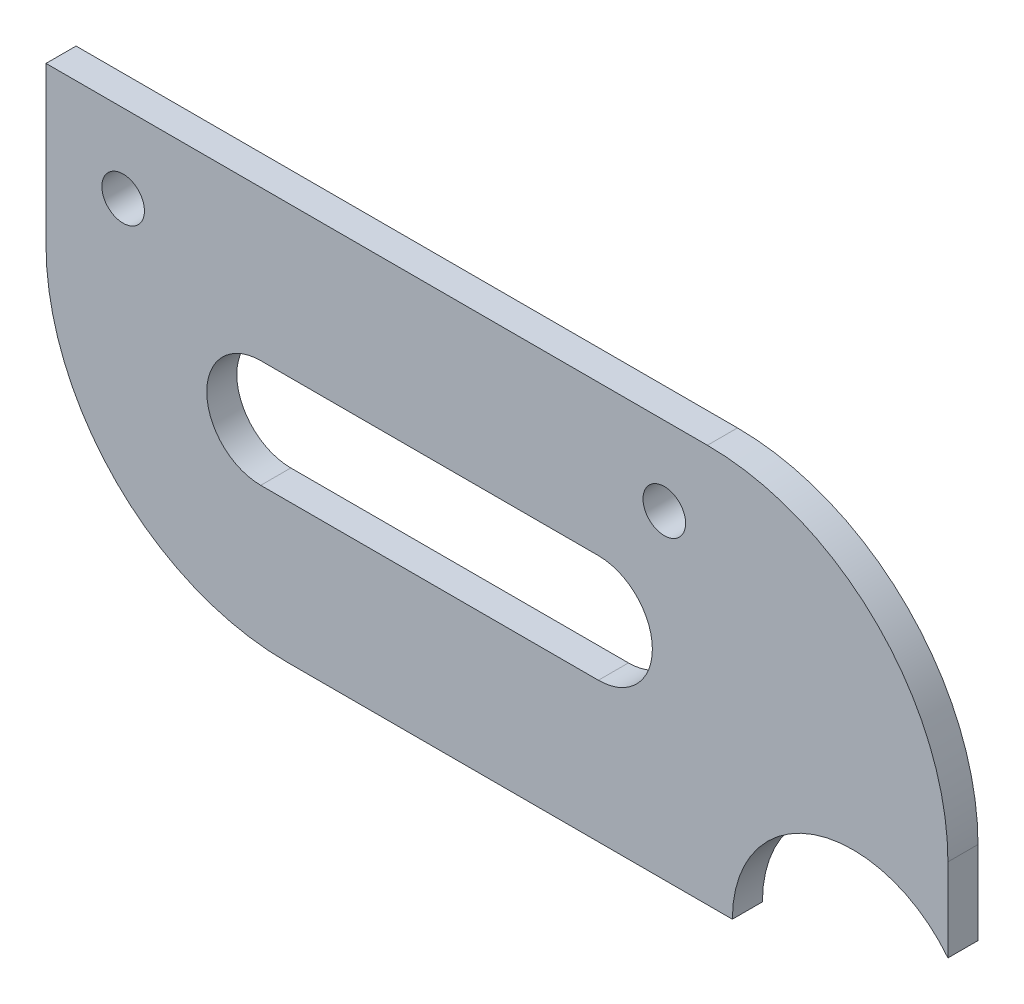
ISO-10303-21;
HEADER;
FILE_DESCRIPTION(('STEP AP214'),'2;1');
FILE_NAME('part.step','',(''),(''),'','','');
FILE_SCHEMA(('AUTOMOTIVE_DESIGN { 1 0 10303 214 1 1 1 1 }'));
ENDSEC;
DATA;
#1=APPLICATION_CONTEXT('core data for automotive mechanical design processes');
#2=APPLICATION_PROTOCOL_DEFINITION('international standard','automotive_design',2000,#1);
#3=PRODUCT_CONTEXT('',#1,'mechanical');
#4=PRODUCT('Part','Part','',(#3));
#5=PRODUCT_RELATED_PRODUCT_CATEGORY('part','',(#4));
#6=PRODUCT_DEFINITION_FORMATION('','',#4);
#7=PRODUCT_DEFINITION_CONTEXT('part definition',#1,'design');
#8=PRODUCT_DEFINITION('design','',#6,#7);
#9=PRODUCT_DEFINITION_SHAPE('','',#8);
#10=(LENGTH_UNIT() NAMED_UNIT(*) SI_UNIT(.MILLI.,.METRE.));
#11=(NAMED_UNIT(*) PLANE_ANGLE_UNIT() SI_UNIT($,.RADIAN.));
#12=(NAMED_UNIT(*) SI_UNIT($,.STERADIAN.) SOLID_ANGLE_UNIT());
#13=UNCERTAINTY_MEASURE_WITH_UNIT(LENGTH_MEASURE(1.E-05),#10,'distance_accuracy_value','');
#14=(GEOMETRIC_REPRESENTATION_CONTEXT(3) GLOBAL_UNCERTAINTY_ASSIGNED_CONTEXT((#13)) GLOBAL_UNIT_ASSIGNED_CONTEXT((#10,
#11,#12)) REPRESENTATION_CONTEXT('',''));
#15=CARTESIAN_POINT('',(0.,0.,0.));
#16=DIRECTION('',(0.,0.,1.));
#17=DIRECTION('',(1.,0.,0.));
#18=AXIS2_PLACEMENT_3D('',#15,#16,#17);
#19=CARTESIAN_POINT('',(70.719661658984,-46.4381788724495,3.175));
#20=DIRECTION('',(0.,0.,1.));
#21=DIRECTION('',(1.,0.,0.));
#22=AXIS2_PLACEMENT_3D('',#19,#20,#21);
#23=PLANE('',#22);
#24=CARTESIAN_POINT('',(50.7999999999998,-12.6990000330051,3.175));
#25=DIRECTION('',(0.,0.,-1.));
#26=DIRECTION('',(-1.,0.,0.));
#27=AXIS2_PLACEMENT_3D('',#24,#25,#26);
#28=CIRCLE('',#27,2.25);
#29=CARTESIAN_POINT('',(48.5499999999998,-12.6990000330051,3.175));
#30=VERTEX_POINT('',#29);
#31=EDGE_CURVE('E150',#30,#30,#28,.T.);
#32=ORIENTED_EDGE('',*,*,#31,.T.);
#33=EDGE_LOOP('',(#32));
#34=FACE_BOUND('',#33,.T.);
#35=CARTESIAN_POINT('',(-6.35,-12.699000033,3.175));
#36=DIRECTION('',(0.,0.,-1.));
#37=DIRECTION('',(-1.,0.,0.));
#38=AXIS2_PLACEMENT_3D('',#35,#36,#37);
#39=CIRCLE('',#38,2.25);
#40=CARTESIAN_POINT('',(-8.6,-12.699000033,3.175));
#41=VERTEX_POINT('',#40);
#42=EDGE_CURVE('E350',#41,#41,#39,.T.);
#43=ORIENTED_EDGE('',*,*,#42,.T.);
#44=EDGE_LOOP('',(#43));
#45=FACE_BOUND('',#44,.T.);
#46=DIRECTION('',(0.,1.,0.));
#47=VECTOR('',#46,1.);
#48=CARTESIAN_POINT('',(80.7528152775164,-4.40562225348035,3.175));
#49=LINE('',#48,#47);
#50=CARTESIAN_POINT('',(80.7528152775164,-38.5964374653407,3.175));
#51=VERTEX_POINT('',#50);
#52=CARTESIAN_POINT('',(80.7528152775164,-29.8056222534803,3.175));
#53=VERTEX_POINT('',#52);
#54=EDGE_CURVE('E168',#51,#53,#49,.T.);
#55=ORIENTED_EDGE('',*,*,#54,.T.);
#56=CARTESIAN_POINT('',(55.3528152775164,-29.8056222534803,3.175));
#57=DIRECTION('',(0.,0.,1.));
#58=DIRECTION('',(1.,0.,0.));
#59=AXIS2_PLACEMENT_3D('',#56,#57,#58);
#60=CIRCLE('',#59,25.4);
#61=CARTESIAN_POINT('',(55.3528152775164,-4.40562225348035,3.175));
#62=VERTEX_POINT('',#61);
#63=EDGE_CURVE('E201',#53,#62,#60,.T.);
#64=ORIENTED_EDGE('',*,*,#63,.T.);
#65=DIRECTION('',(-1.,0.,0.));
#66=VECTOR('',#65,1.);
#67=CARTESIAN_POINT('',(-14.4971847224836,-4.40562225348035,3.175));
#68=LINE('',#67,#66);
#69=CARTESIAN_POINT('',(-14.4971847224836,-4.40562225348035,3.175));
#70=VERTEX_POINT('',#69);
#71=EDGE_CURVE('E171',#62,#70,#68,.T.);
#72=ORIENTED_EDGE('',*,*,#71,.T.);
#73=DIRECTION('',(0.,-1.,0.));
#74=VECTOR('',#73,1.);
#75=CARTESIAN_POINT('',(-14.4971847224836,-4.40562225348035,3.175));
#76=LINE('',#75,#74);
#77=CARTESIAN_POINT('',(-14.4971847224836,-21.0381788724495,3.175));
#78=VERTEX_POINT('',#77);
#79=EDGE_CURVE('E161',#70,#78,#76,.T.);
#80=ORIENTED_EDGE('',*,*,#79,.T.);
#81=CARTESIAN_POINT('',(10.9028152775164,-21.0381788724495,3.175));
#82=DIRECTION('',(0.,0.,1.));
#83=DIRECTION('',(1.,0.,0.));
#84=AXIS2_PLACEMENT_3D('',#81,#82,#83);
#85=CIRCLE('',#84,25.4);
#86=CARTESIAN_POINT('',(10.9028152775164,-46.4381788724495,3.175));
#87=VERTEX_POINT('',#86);
#88=EDGE_CURVE('E49',#78,#87,#85,.T.);
#89=ORIENTED_EDGE('',*,*,#88,.T.);
#90=DIRECTION('',(1.,0.,0.));
#91=VECTOR('',#90,1.);
#92=CARTESIAN_POINT('',(57.985570414257,-46.4381788724495,3.175));
#93=LINE('',#92,#91);
#94=CARTESIAN_POINT('',(57.985570414257,-46.4381788724495,3.175));
#95=VERTEX_POINT('',#94);
#96=EDGE_CURVE('E163',#87,#95,#93,.T.);
#97=ORIENTED_EDGE('',*,*,#96,.T.);
#98=CARTESIAN_POINT('',(70.719661658984,-46.4381788724495,3.175));
#99=DIRECTION('',(0.,0.,-1.));
#100=DIRECTION('',(1.,0.,0.));
#101=AXIS2_PLACEMENT_3D('',#98,#99,#100);
#102=CIRCLE('',#101,12.7340912447271);
#103=EDGE_CURVE('E166',#95,#51,#102,.T.);
#104=ORIENTED_EDGE('',*,*,#103,.T.);
#105=EDGE_LOOP('',(#55,#64,#72,#80,#89,#97,#104));
#106=FACE_BOUND('',#105,.T.);
#107=DIRECTION('',(1.,0.,0.));
#108=VECTOR('',#107,1.);
#109=CARTESIAN_POINT('',(8.18012904212218,-31.654487563312,3.175));
#110=LINE('',#109,#108);
#111=CARTESIAN_POINT('',(8.18012904212218,-31.654487563312,3.175));
#112=VERTEX_POINT('',#111);
#113=CARTESIAN_POINT('',(43.8381196955397,-31.654487563312,3.175));
#114=VERTEX_POINT('',#113);
#115=EDGE_CURVE('E128',#112,#114,#110,.T.);
#116=ORIENTED_EDGE('',*,*,#115,.F.);
#117=CARTESIAN_POINT('',(8.18012904212218,-25.954568173356,3.175));
#118=DIRECTION('',(0.,0.,1.));
#119=DIRECTION('',(1.,0.,0.));
#120=AXIS2_PLACEMENT_3D('',#117,#118,#119);
#121=CIRCLE('',#120,5.69991938995607);
#122=CARTESIAN_POINT('',(8.18012904212218,-20.2546487833999,3.175));
#123=VERTEX_POINT('',#122);
#124=EDGE_CURVE('E118',#123,#112,#121,.T.);
#125=ORIENTED_EDGE('',*,*,#124,.F.);
#126=DIRECTION('',(-1.,0.,0.));
#127=VECTOR('',#126,1.);
#128=CARTESIAN_POINT('',(8.18012904212218,-20.2546487833999,3.175));
#129=LINE('',#128,#127);
#130=CARTESIAN_POINT('',(43.8381196955397,-20.2546487833999,3.175));
#131=VERTEX_POINT('',#130);
#132=EDGE_CURVE('E143',#131,#123,#129,.T.);
#133=ORIENTED_EDGE('',*,*,#132,.F.);
#134=CARTESIAN_POINT('',(43.8381196955397,-25.954568173356,3.175));
#135=DIRECTION('',(0.,0.,1.));
#136=DIRECTION('',(1.,0.,0.));
#137=AXIS2_PLACEMENT_3D('',#134,#135,#136);
#138=CIRCLE('',#137,5.69991938995607);
#139=EDGE_CURVE('E141',#114,#131,#138,.T.);
#140=ORIENTED_EDGE('',*,*,#139,.F.);
#141=EDGE_LOOP('',(#116,#125,#133,#140));
#142=FACE_BOUND('',#141,.T.);
#143=ADVANCED_FACE('F34',(#34,#45,#106,#142),#23,.T.);
#144=CARTESIAN_POINT('',(70.719661658984,-46.4381788724495,0.));
#145=DIRECTION('',(0.,0.,1.));
#146=DIRECTION('',(1.,0.,0.));
#147=AXIS2_PLACEMENT_3D('',#144,#145,#146);
#148=PLANE('',#147);
#149=CARTESIAN_POINT('',(50.7999999999998,-12.6990000330051,0.));
#150=DIRECTION('',(0.,0.,-1.));
#151=DIRECTION('',(-1.,0.,0.));
#152=AXIS2_PLACEMENT_3D('',#149,#150,#151);
#153=CIRCLE('',#152,2.25);
#154=CARTESIAN_POINT('',(48.5499999999998,-12.6990000330051,0.));
#155=VERTEX_POINT('',#154);
#156=EDGE_CURVE('E349',#155,#155,#153,.T.);
#157=ORIENTED_EDGE('',*,*,#156,.F.);
#158=EDGE_LOOP('',(#157));
#159=FACE_BOUND('',#158,.T.);
#160=CARTESIAN_POINT('',(-6.35,-12.699000033,0.));
#161=DIRECTION('',(0.,0.,-1.));
#162=DIRECTION('',(-1.,0.,0.));
#163=AXIS2_PLACEMENT_3D('',#160,#161,#162);
#164=CIRCLE('',#163,2.25);
#165=CARTESIAN_POINT('',(-8.6,-12.699000033,0.));
#166=VERTEX_POINT('',#165);
#167=EDGE_CURVE('E354',#166,#166,#164,.T.);
#168=ORIENTED_EDGE('',*,*,#167,.F.);
#169=EDGE_LOOP('',(#168));
#170=FACE_BOUND('',#169,.T.);
#171=DIRECTION('',(-1.,0.,0.));
#172=VECTOR('',#171,1.);
#173=CARTESIAN_POINT('',(-14.4971847224836,-4.40562225348035,0.));
#174=LINE('',#173,#172);
#175=CARTESIAN_POINT('',(55.3528152775164,-4.40562225348035,0.));
#176=VERTEX_POINT('',#175);
#177=CARTESIAN_POINT('',(-14.4971847224836,-4.40562225348035,0.));
#178=VERTEX_POINT('',#177);
#179=EDGE_CURVE('E164',#176,#178,#174,.T.);
#180=ORIENTED_EDGE('',*,*,#179,.F.);
#181=CARTESIAN_POINT('',(55.3528152775164,-29.8056222534803,0.));
#182=DIRECTION('',(0.,0.,1.));
#183=DIRECTION('',(1.,0.,0.));
#184=AXIS2_PLACEMENT_3D('',#181,#182,#183);
#185=CIRCLE('',#184,25.4);
#186=CARTESIAN_POINT('',(80.7528152775164,-29.8056222534803,0.));
#187=VERTEX_POINT('',#186);
#188=EDGE_CURVE('E196',#176,#187,#185,.F.);
#189=ORIENTED_EDGE('',*,*,#188,.T.);
#190=DIRECTION('',(0.,1.,0.));
#191=VECTOR('',#190,1.);
#192=CARTESIAN_POINT('',(80.7528152775164,-4.40562225348035,0.));
#193=LINE('',#192,#191);
#194=CARTESIAN_POINT('',(80.7528152775164,-38.5964374653407,0.));
#195=VERTEX_POINT('',#194);
#196=EDGE_CURVE('E179',#195,#187,#193,.T.);
#197=ORIENTED_EDGE('',*,*,#196,.F.);
#198=CARTESIAN_POINT('',(70.719661658984,-46.4381788724495,0.));
#199=DIRECTION('',(0.,0.,-1.));
#200=DIRECTION('',(1.,0.,0.));
#201=AXIS2_PLACEMENT_3D('',#198,#199,#200);
#202=CIRCLE('',#201,12.7340912447271);
#203=CARTESIAN_POINT('',(57.985570414257,-46.4381788724495,0.));
#204=VERTEX_POINT('',#203);
#205=EDGE_CURVE('E177',#204,#195,#202,.T.);
#206=ORIENTED_EDGE('',*,*,#205,.F.);
#207=DIRECTION('',(1.,0.,0.));
#208=VECTOR('',#207,1.);
#209=CARTESIAN_POINT('',(57.985570414257,-46.4381788724495,0.));
#210=LINE('',#209,#208);
#211=CARTESIAN_POINT('',(10.9028152775164,-46.4381788724495,0.));
#212=VERTEX_POINT('',#211);
#213=EDGE_CURVE('E175',#212,#204,#210,.T.);
#214=ORIENTED_EDGE('',*,*,#213,.F.);
#215=CARTESIAN_POINT('',(10.9028152775164,-21.0381788724495,0.));
#216=DIRECTION('',(0.,0.,1.));
#217=DIRECTION('',(1.,0.,0.));
#218=AXIS2_PLACEMENT_3D('',#215,#216,#217);
#219=CIRCLE('',#218,25.4);
#220=CARTESIAN_POINT('',(-14.4971847224836,-21.0381788724495,0.));
#221=VERTEX_POINT('',#220);
#222=EDGE_CURVE('E194',#212,#221,#219,.F.);
#223=ORIENTED_EDGE('',*,*,#222,.T.);
#224=DIRECTION('',(0.,-1.,0.));
#225=VECTOR('',#224,1.);
#226=CARTESIAN_POINT('',(-14.4971847224836,-4.40562225348035,0.));
#227=LINE('',#226,#225);
#228=EDGE_CURVE('E136',#178,#221,#227,.T.);
#229=ORIENTED_EDGE('',*,*,#228,.F.);
#230=EDGE_LOOP('',(#180,#189,#197,#206,#214,#223,#229));
#231=FACE_BOUND('',#230,.T.);
#232=CARTESIAN_POINT('',(8.18012904212218,-25.954568173356,0.));
#233=DIRECTION('',(0.,0.,1.));
#234=DIRECTION('',(1.,0.,0.));
#235=AXIS2_PLACEMENT_3D('',#232,#233,#234);
#236=CIRCLE('',#235,5.69991938995607);
#237=CARTESIAN_POINT('',(8.18012904212218,-20.2546487833999,0.));
#238=VERTEX_POINT('',#237);
#239=CARTESIAN_POINT('',(8.18012904212218,-31.654487563312,0.));
#240=VERTEX_POINT('',#239);
#241=EDGE_CURVE('E148',#238,#240,#236,.T.);
#242=ORIENTED_EDGE('',*,*,#241,.T.);
#243=DIRECTION('',(1.,0.,0.));
#244=VECTOR('',#243,1.);
#245=CARTESIAN_POINT('',(8.18012904212218,-31.654487563312,0.));
#246=LINE('',#245,#244);
#247=CARTESIAN_POINT('',(43.8381196955397,-31.654487563312,0.));
#248=VERTEX_POINT('',#247);
#249=EDGE_CURVE('E135',#240,#248,#246,.T.);
#250=ORIENTED_EDGE('',*,*,#249,.T.);
#251=CARTESIAN_POINT('',(43.8381196955397,-25.954568173356,0.));
#252=DIRECTION('',(0.,0.,1.));
#253=DIRECTION('',(1.,0.,0.));
#254=AXIS2_PLACEMENT_3D('',#251,#252,#253);
#255=CIRCLE('',#254,5.69991938995607);
#256=CARTESIAN_POINT('',(43.8381196955397,-20.2546487833999,0.));
#257=VERTEX_POINT('',#256);
#258=EDGE_CURVE('E152',#248,#257,#255,.T.);
#259=ORIENTED_EDGE('',*,*,#258,.T.);
#260=DIRECTION('',(-1.,0.,0.));
#261=VECTOR('',#260,1.);
#262=CARTESIAN_POINT('',(8.18012904212218,-20.2546487833999,0.));
#263=LINE('',#262,#261);
#264=EDGE_CURVE('E129',#257,#238,#263,.T.);
#265=ORIENTED_EDGE('',*,*,#264,.T.);
#266=EDGE_LOOP('',(#242,#250,#259,#265));
#267=FACE_BOUND('',#266,.T.);
#268=ADVANCED_FACE('F212',(#159,#170,#231,#267),#148,.F.);
#269=CARTESIAN_POINT('',(-14.4971847224836,-4.40562225348035,3.175));
#270=DIRECTION('',(1.,0.,0.));
#271=DIRECTION('',(0.,0.,-1.));
#272=AXIS2_PLACEMENT_3D('',#269,#270,#271);
#273=PLANE('',#272);
#274=ORIENTED_EDGE('',*,*,#228,.T.);
#275=DIRECTION('',(0.,0.,-1.));
#276=VECTOR('',#275,1.);
#277=CARTESIAN_POINT('',(-14.4971847224836,-21.0381788724495,3.175));
#278=LINE('',#277,#276);
#279=EDGE_CURVE('E11',#221,#78,#278,.F.);
#280=ORIENTED_EDGE('',*,*,#279,.T.);
#281=ORIENTED_EDGE('',*,*,#79,.F.);
#282=DIRECTION('',(0.,0.,-1.));
#283=VECTOR('',#282,1.);
#284=CARTESIAN_POINT('',(-14.4971847224836,-4.40562225348035,3.175));
#285=LINE('',#284,#283);
#286=EDGE_CURVE('E173',#70,#178,#285,.T.);
#287=ORIENTED_EDGE('',*,*,#286,.T.);
#288=EDGE_LOOP('',(#274,#280,#281,#287));
#289=FACE_BOUND('',#288,.T.);
#290=ADVANCED_FACE('F232',(#289),#273,.F.);
#291=CARTESIAN_POINT('',(57.985570414257,-46.4381788724495,3.175));
#292=DIRECTION('',(0.,1.,0.));
#293=DIRECTION('',(0.,0.,1.));
#294=AXIS2_PLACEMENT_3D('',#291,#292,#293);
#295=PLANE('',#294);
#296=ORIENTED_EDGE('',*,*,#96,.F.);
#297=DIRECTION('',(0.,0.,-1.));
#298=VECTOR('',#297,1.);
#299=CARTESIAN_POINT('',(10.9028152775164,-46.4381788724495,3.175));
#300=LINE('',#299,#298);
#301=EDGE_CURVE('E42',#87,#212,#300,.T.);
#302=ORIENTED_EDGE('',*,*,#301,.T.);
#303=ORIENTED_EDGE('',*,*,#213,.T.);
#304=DIRECTION('',(0.,0.,-1.));
#305=VECTOR('',#304,1.);
#306=CARTESIAN_POINT('',(57.985570414257,-46.4381788724495,3.175));
#307=LINE('',#306,#305);
#308=EDGE_CURVE('E188',#95,#204,#307,.T.);
#309=ORIENTED_EDGE('',*,*,#308,.F.);
#310=EDGE_LOOP('',(#296,#302,#303,#309));
#311=FACE_BOUND('',#310,.T.);
#312=ADVANCED_FACE('F206',(#311),#295,.F.);
#313=CARTESIAN_POINT('',(70.719661658984,-46.4381788724495,3.175));
#314=DIRECTION('',(0.,0.,-1.));
#315=DIRECTION('',(-1.,0.,0.));
#316=AXIS2_PLACEMENT_3D('',#313,#314,#315);
#317=CYLINDRICAL_SURFACE('',#316,12.7340912447271);
#318=ORIENTED_EDGE('',*,*,#205,.T.);
#319=DIRECTION('',(0.,0.,-1.));
#320=VECTOR('',#319,1.);
#321=CARTESIAN_POINT('',(80.7528152775164,-38.5964374653407,3.175));
#322=LINE('',#321,#320);
#323=EDGE_CURVE('E185',#51,#195,#322,.T.);
#324=ORIENTED_EDGE('',*,*,#323,.F.);
#325=ORIENTED_EDGE('',*,*,#103,.F.);
#326=ORIENTED_EDGE('',*,*,#308,.T.);
#327=EDGE_LOOP('',(#318,#324,#325,#326));
#328=FACE_BOUND('',#327,.T.);
#329=ADVANCED_FACE('F218',(#328),#317,.F.);
#330=CARTESIAN_POINT('',(80.7528152775164,-4.40562225348035,3.175));
#331=DIRECTION('',(-1.,0.,0.));
#332=DIRECTION('',(0.,-1.,0.));
#333=AXIS2_PLACEMENT_3D('',#330,#331,#332);
#334=PLANE('',#333);
#335=ORIENTED_EDGE('',*,*,#196,.T.);
#336=DIRECTION('',(0.,0.,-1.));
#337=VECTOR('',#336,1.);
#338=CARTESIAN_POINT('',(80.7528152775164,-29.8056222534803,3.175));
#339=LINE('',#338,#337);
#340=EDGE_CURVE('E198',#187,#53,#339,.F.);
#341=ORIENTED_EDGE('',*,*,#340,.T.);
#342=ORIENTED_EDGE('',*,*,#54,.F.);
#343=ORIENTED_EDGE('',*,*,#323,.T.);
#344=EDGE_LOOP('',(#335,#341,#342,#343));
#345=FACE_BOUND('',#344,.T.);
#346=ADVANCED_FACE('F222',(#345),#334,.F.);
#347=CARTESIAN_POINT('',(-14.4971847224836,-4.40562225348035,3.175));
#348=DIRECTION('',(0.,-1.,0.));
#349=DIRECTION('',(0.,0.,-1.));
#350=AXIS2_PLACEMENT_3D('',#347,#348,#349);
#351=PLANE('',#350);
#352=ORIENTED_EDGE('',*,*,#71,.F.);
#353=DIRECTION('',(0.,0.,-1.));
#354=VECTOR('',#353,1.);
#355=CARTESIAN_POINT('',(55.3528152775164,-4.40562225348035,3.175));
#356=LINE('',#355,#354);
#357=EDGE_CURVE('E191',#62,#176,#356,.T.);
#358=ORIENTED_EDGE('',*,*,#357,.T.);
#359=ORIENTED_EDGE('',*,*,#179,.T.);
#360=ORIENTED_EDGE('',*,*,#286,.F.);
#361=EDGE_LOOP('',(#352,#358,#359,#360));
#362=FACE_BOUND('',#361,.T.);
#363=ADVANCED_FACE('F230',(#362),#351,.F.);
#364=CARTESIAN_POINT('',(8.18012904212218,-25.954568173356,3.175));
#365=DIRECTION('',(0.,0.,-1.));
#366=DIRECTION('',(-1.,0.,0.));
#367=AXIS2_PLACEMENT_3D('',#364,#365,#366);
#368=CYLINDRICAL_SURFACE('',#367,5.69991938995607);
#369=ORIENTED_EDGE('',*,*,#241,.F.);
#370=DIRECTION('',(0.,0.,-1.));
#371=VECTOR('',#370,1.);
#372=CARTESIAN_POINT('',(8.18012904212218,-20.2546487833999,3.175));
#373=LINE('',#372,#371);
#374=EDGE_CURVE('E124',#123,#238,#373,.T.);
#375=ORIENTED_EDGE('',*,*,#374,.F.);
#376=ORIENTED_EDGE('',*,*,#124,.T.);
#377=DIRECTION('',(0.,0.,-1.));
#378=VECTOR('',#377,1.);
#379=CARTESIAN_POINT('',(8.18012904212218,-31.654487563312,3.175));
#380=LINE('',#379,#378);
#381=EDGE_CURVE('E121',#112,#240,#380,.T.);
#382=ORIENTED_EDGE('',*,*,#381,.T.);
#383=EDGE_LOOP('',(#369,#375,#376,#382));
#384=FACE_BOUND('',#383,.T.);
#385=ADVANCED_FACE('F120',(#384),#368,.F.);
#386=CARTESIAN_POINT('',(8.18012904212218,-31.654487563312,3.175));
#387=DIRECTION('',(0.,1.,0.));
#388=DIRECTION('',(0.,0.,1.));
#389=AXIS2_PLACEMENT_3D('',#386,#387,#388);
#390=PLANE('',#389);
#391=ORIENTED_EDGE('',*,*,#249,.F.);
#392=ORIENTED_EDGE('',*,*,#381,.F.);
#393=ORIENTED_EDGE('',*,*,#115,.T.);
#394=DIRECTION('',(0.,0.,-1.));
#395=VECTOR('',#394,1.);
#396=CARTESIAN_POINT('',(43.8381196955397,-31.654487563312,3.175));
#397=LINE('',#396,#395);
#398=EDGE_CURVE('E137',#114,#248,#397,.T.);
#399=ORIENTED_EDGE('',*,*,#398,.T.);
#400=EDGE_LOOP('',(#391,#392,#393,#399));
#401=FACE_BOUND('',#400,.T.);
#402=ADVANCED_FACE('F132',(#401),#390,.T.);
#403=CARTESIAN_POINT('',(43.8381196955397,-25.954568173356,3.175));
#404=DIRECTION('',(0.,0.,-1.));
#405=DIRECTION('',(-1.,0.,0.));
#406=AXIS2_PLACEMENT_3D('',#403,#404,#405);
#407=CYLINDRICAL_SURFACE('',#406,5.69991938995607);
#408=ORIENTED_EDGE('',*,*,#258,.F.);
#409=ORIENTED_EDGE('',*,*,#398,.F.);
#410=ORIENTED_EDGE('',*,*,#139,.T.);
#411=DIRECTION('',(0.,0.,-1.));
#412=VECTOR('',#411,1.);
#413=CARTESIAN_POINT('',(43.8381196955397,-20.2546487833999,3.175));
#414=LINE('',#413,#412);
#415=EDGE_CURVE('E158',#131,#257,#414,.T.);
#416=ORIENTED_EDGE('',*,*,#415,.T.);
#417=EDGE_LOOP('',(#408,#409,#410,#416));
#418=FACE_BOUND('',#417,.T.);
#419=ADVANCED_FACE('F298',(#418),#407,.F.);
#420=CARTESIAN_POINT('',(8.18012904212218,-20.2546487833999,3.175));
#421=DIRECTION('',(0.,-1.,0.));
#422=DIRECTION('',(0.,0.,-1.));
#423=AXIS2_PLACEMENT_3D('',#420,#421,#422);
#424=PLANE('',#423);
#425=ORIENTED_EDGE('',*,*,#264,.F.);
#426=ORIENTED_EDGE('',*,*,#415,.F.);
#427=ORIENTED_EDGE('',*,*,#132,.T.);
#428=ORIENTED_EDGE('',*,*,#374,.T.);
#429=EDGE_LOOP('',(#425,#426,#427,#428));
#430=FACE_BOUND('',#429,.T.);
#431=ADVANCED_FACE('F242',(#430),#424,.T.);
#432=CARTESIAN_POINT('',(55.3528152775164,-29.8056222534803,3.175));
#433=DIRECTION('',(0.,0.,-1.));
#434=DIRECTION('',(-1.,0.,0.));
#435=AXIS2_PLACEMENT_3D('',#432,#433,#434);
#436=CYLINDRICAL_SURFACE('',#435,25.4);
#437=ORIENTED_EDGE('',*,*,#63,.F.);
#438=ORIENTED_EDGE('',*,*,#340,.F.);
#439=ORIENTED_EDGE('',*,*,#188,.F.);
#440=ORIENTED_EDGE('',*,*,#357,.F.);
#441=EDGE_LOOP('',(#437,#438,#439,#440));
#442=FACE_BOUND('',#441,.T.);
#443=ADVANCED_FACE('F228',(#442),#436,.T.);
#444=CARTESIAN_POINT('',(10.9028152775164,-21.0381788724495,3.175));
#445=DIRECTION('',(0.,0.,-1.));
#446=DIRECTION('',(-1.,0.,0.));
#447=AXIS2_PLACEMENT_3D('',#444,#445,#446);
#448=CYLINDRICAL_SURFACE('',#447,25.4);
#449=ORIENTED_EDGE('',*,*,#88,.F.);
#450=ORIENTED_EDGE('',*,*,#279,.F.);
#451=ORIENTED_EDGE('',*,*,#222,.F.);
#452=ORIENTED_EDGE('',*,*,#301,.F.);
#453=EDGE_LOOP('',(#449,#450,#451,#452));
#454=FACE_BOUND('',#453,.T.);
#455=ADVANCED_FACE('F36',(#454),#448,.T.);
#456=CARTESIAN_POINT('',(-6.35,-12.699000033,3.175));
#457=DIRECTION('',(0.,0.,-1.));
#458=DIRECTION('',(-1.,0.,0.));
#459=AXIS2_PLACEMENT_3D('',#456,#457,#458);
#460=CYLINDRICAL_SURFACE('',#459,2.25);
#461=ORIENTED_EDGE('',*,*,#42,.F.);
#462=EDGE_LOOP('',(#461));
#463=FACE_BOUND('',#462,.T.);
#464=ORIENTED_EDGE('',*,*,#167,.T.);
#465=EDGE_LOOP('',(#464));
#466=FACE_BOUND('',#465,.T.);
#467=ADVANCED_FACE('F234',(#463,#466),#460,.F.);
#468=CARTESIAN_POINT('',(50.7999999999998,-12.6990000330051,3.175));
#469=DIRECTION('',(0.,0.,-1.));
#470=DIRECTION('',(-1.,0.,0.));
#471=AXIS2_PLACEMENT_3D('',#468,#469,#470);
#472=CYLINDRICAL_SURFACE('',#471,2.25);
#473=ORIENTED_EDGE('',*,*,#31,.F.);
#474=EDGE_LOOP('',(#473));
#475=FACE_BOUND('',#474,.T.);
#476=ORIENTED_EDGE('',*,*,#156,.T.);
#477=EDGE_LOOP('',(#476));
#478=FACE_BOUND('',#477,.T.);
#479=ADVANCED_FACE('F239',(#475,#478),#472,.F.);
#480=CLOSED_SHELL('',(#143,#268,#290,#312,#329,#346,#363,#385,#402,#419,#431,#443,#455,#467,#479));
#481=MANIFOLD_SOLID_BREP('B2',#480);
#482=ADVANCED_BREP_SHAPE_REPRESENTATION('',(#18,#481),#14);
#483=SHAPE_DEFINITION_REPRESENTATION(#9,#482);
ENDSEC;
END-ISO-10303-21;
